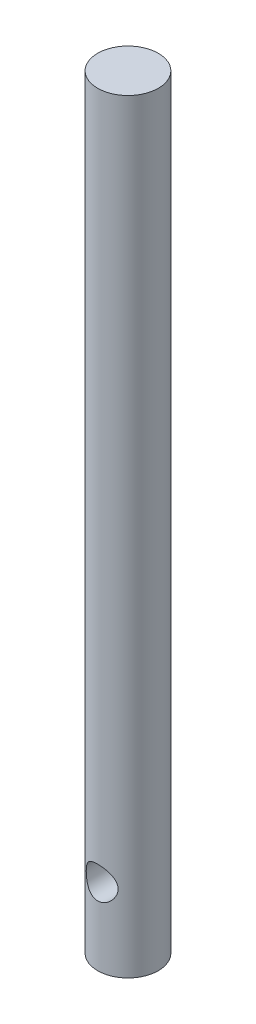
ISO-10303-21;
HEADER;
FILE_DESCRIPTION(('STEP AP214'),'2;1');
FILE_NAME('part.step','',(''),(''),'','','');
FILE_SCHEMA(('AUTOMOTIVE_DESIGN { 1 0 10303 214 1 1 1 1 }'));
ENDSEC;
DATA;
#1=APPLICATION_CONTEXT('core data for automotive mechanical design processes');
#2=APPLICATION_PROTOCOL_DEFINITION('international standard','automotive_design',2000,#1);
#3=PRODUCT_CONTEXT('',#1,'mechanical');
#4=PRODUCT('Part','Part','',(#3));
#5=PRODUCT_RELATED_PRODUCT_CATEGORY('part','',(#4));
#6=PRODUCT_DEFINITION_FORMATION('','',#4);
#7=PRODUCT_DEFINITION_CONTEXT('part definition',#1,'design');
#8=PRODUCT_DEFINITION('design','',#6,#7);
#9=PRODUCT_DEFINITION_SHAPE('','',#8);
#10=(LENGTH_UNIT() NAMED_UNIT(*) SI_UNIT(.MILLI.,.METRE.));
#11=(NAMED_UNIT(*) PLANE_ANGLE_UNIT() SI_UNIT($,.RADIAN.));
#12=(NAMED_UNIT(*) SI_UNIT($,.STERADIAN.) SOLID_ANGLE_UNIT());
#13=UNCERTAINTY_MEASURE_WITH_UNIT(LENGTH_MEASURE(1.E-05),#10,'distance_accuracy_value','');
#14=(GEOMETRIC_REPRESENTATION_CONTEXT(3) GLOBAL_UNCERTAINTY_ASSIGNED_CONTEXT((#13)) GLOBAL_UNIT_ASSIGNED_CONTEXT((#10,
#11,#12)) REPRESENTATION_CONTEXT('',''));
#15=CARTESIAN_POINT('',(0.,0.,0.));
#16=DIRECTION('',(0.,0.,1.));
#17=DIRECTION('',(1.,0.,0.));
#18=AXIS2_PLACEMENT_3D('',#15,#16,#17);
#19=CARTESIAN_POINT('',(0.,120.,0.));
#20=DIRECTION('',(0.,-1.,0.));
#21=DIRECTION('',(0.,0.,-1.));
#22=AXIS2_PLACEMENT_3D('',#19,#20,#21);
#23=CYLINDRICAL_SURFACE('',#22,4.7625);
#24=CARTESIAN_POINT('',(0.,14.5,-4.7625));
#25=CARTESIAN_POINT('',(-0.13062742122521,14.4999898734514,-4.76249124231613));
#26=CARTESIAN_POINT('',(-0.261392577954304,14.4897011265119,-4.75706877903841));
#27=CARTESIAN_POINT('',(-0.519004450887695,14.4490214465179,-4.73590787240178));
#28=CARTESIAN_POINT('',(-0.645844384851267,14.4185975537372,-4.72015251525231));
#29=CARTESIAN_POINT('',(-0.891501022140106,14.3391928326362,-4.67996420289121));
#30=CARTESIAN_POINT('',(-1.01034767016377,14.2902864003055,-4.65556606099746));
#31=CARTESIAN_POINT('',(-1.23794382020764,14.1757168882932,-4.60028670223669));
#32=CARTESIAN_POINT('',(-1.34669348083588,14.1100540718892,-4.56940558723199));
#33=CARTESIAN_POINT('',(-1.55892133995746,13.959033008405,-4.50159635346788));
#34=CARTESIAN_POINT('',(-1.66160312776822,13.8726752730372,-4.4644062529016));
#35=CARTESIAN_POINT('',(-1.85177188990194,13.6848795061989,-4.38894458289406));
#36=CARTESIAN_POINT('',(-1.93924600469647,13.5834288454403,-4.35067212970659));
#37=CARTESIAN_POINT('',(-2.10422763598031,13.3577376835749,-4.2734802142377));
#38=CARTESIAN_POINT('',(-2.18018973516794,13.2322790849485,-4.23479802820823));
#39=CARTESIAN_POINT('',(-2.30963791504339,12.9680499369322,-4.16562294885068));
#40=CARTESIAN_POINT('',(-2.36314108926497,12.8292896106869,-4.13512383377351));
#41=CARTESIAN_POINT('',(-2.4232489502503,12.6186966833969,-4.09996952403756));
#42=CARTESIAN_POINT('',(-2.43967751578654,12.5503969014835,-4.09018641832971));
#43=CARTESIAN_POINT('',(-2.46677009527986,12.4122930024643,-4.07390549926443));
#44=CARTESIAN_POINT('',(-2.47743732586381,12.3424897474527,-4.06740585284109));
#45=CARTESIAN_POINT('',(-2.49282280702981,12.2020414408674,-4.05799501167303));
#46=CARTESIAN_POINT('',(-2.4975455796926,12.1313970704988,-4.05508108922647));
#47=CARTESIAN_POINT('',(-2.50098217922734,11.9899299323812,-4.05296092161601));
#48=CARTESIAN_POINT('',(-2.49969669147794,11.9191071859012,-4.05375425355549));
#49=CARTESIAN_POINT('',(-2.48799202626699,11.7265265787753,-4.06096295843877));
#50=CARTESIAN_POINT('',(-2.47160741979408,11.6052041391416,-4.07104911907534));
#51=CARTESIAN_POINT('',(-2.4217116946248,11.3674555676512,-4.10091839522592));
#52=CARTESIAN_POINT('',(-2.38819409172343,11.2510313076425,-4.12070518195181));
#53=CARTESIAN_POINT('',(-2.30445419048023,11.0229734463351,-4.16812330580372));
#54=CARTESIAN_POINT('',(-2.25386859885826,10.9115094942428,-4.19592314410569));
#55=CARTESIAN_POINT('',(-2.13771806028806,10.6981000286017,-4.25627134083856));
#56=CARTESIAN_POINT('',(-2.07214642279414,10.5961587952102,-4.28882181784726));
#57=CARTESIAN_POINT('',(-1.91707717493105,10.389477963539,-4.36056222368142));
#58=CARTESIAN_POINT('',(-1.82550601334369,10.2863879547987,-4.40003945957641));
#59=CARTESIAN_POINT('',(-1.62631292573417,10.0963000566835,-4.47749235013782));
#60=CARTESIAN_POINT('',(-1.51868183519853,10.0093114193899,-4.51546713168007));
#61=CARTESIAN_POINT('',(-1.28285311381234,9.84925644738106,-4.58821726237082));
#62=CARTESIAN_POINT('',(-1.15384113644327,9.77724297891873,-4.62269422182368));
#63=CARTESIAN_POINT('',(-0.883274583487361,9.65655951919273,-4.68191671322414));
#64=CARTESIAN_POINT('',(-0.741731021742617,9.60786926609562,-4.70667068854853));
#65=CARTESIAN_POINT('',(-0.463482648356823,9.53954031968048,-4.74178157874757));
#66=CARTESIAN_POINT('',(-0.327451533146031,9.51771868966614,-4.7532154346413));
#67=CARTESIAN_POINT('',(-0.0532027411688526,9.49679213134956,-4.76417535094783));
#68=CARTESIAN_POINT('',(0.0850136913180013,9.49767471039915,-4.76370795984351));
#69=CARTESIAN_POINT('',(0.346844432807783,9.52099639780689,-4.75150400862097));
#70=CARTESIAN_POINT('',(0.470680368684627,9.54154746222735,-4.74075451239977));
#71=CARTESIAN_POINT('',(0.712860226199036,9.60054849782026,-4.710428305764));
#72=CARTESIAN_POINT('',(0.831203566825309,9.63900035782977,-4.69085066383741));
#73=CARTESIAN_POINT('',(1.06265581547702,9.73354813372294,-4.64397292939134));
#74=CARTESIAN_POINT('',(1.17554845250708,9.79007704285111,-4.61648518425677));
#75=CARTESIAN_POINT('',(1.39058524799197,9.91865766067269,-4.55633242252807));
#76=CARTESIAN_POINT('',(1.49272507029362,9.99071559614235,-4.52366533052982));
#77=CARTESIAN_POINT('',(1.69480039032759,10.1570314052753,-4.45215890340881));
#78=CARTESIAN_POINT('',(1.79336890820231,10.2528286364182,-4.41303191650165));
#79=CARTESIAN_POINT('',(1.97371435217978,10.4594542622761,-4.33537986737606));
#80=CARTESIAN_POINT('',(2.0554767234399,10.5702955490265,-4.2968553533759));
#81=CARTESIAN_POINT('',(2.20479830589222,10.8124293314126,-4.22228238623147));
#82=CARTESIAN_POINT('',(2.27115503352735,10.9445658072701,-4.18653780097845));
#83=CARTESIAN_POINT('',(2.37999935200244,11.2205600641342,-4.1256452905888));
#84=CARTESIAN_POINT('',(2.42252029102059,11.3644011449544,-4.10048257295431));
#85=CARTESIAN_POINT('',(2.47834245295767,11.6447599982397,-4.06696362690653));
#86=CARTESIAN_POINT('',(2.49409685007316,11.780615988852,-4.05720315494866));
#87=CARTESIAN_POINT('',(2.50314491556986,12.0533274801695,-4.05163151557573));
#88=CARTESIAN_POINT('',(2.49645222775029,12.190182323289,-4.05581187462847));
#89=CARTESIAN_POINT('',(2.46314240917376,12.4443675606173,-4.07610444272209));
#90=CARTESIAN_POINT('',(2.43889590355155,12.5621384578597,-4.09079472815573));
#91=CARTESIAN_POINT('',(2.37431443322139,12.7917471574109,-4.12861104406669));
#92=CARTESIAN_POINT('',(2.33397375533869,12.9035828368216,-4.15174006991293));
#93=CARTESIAN_POINT('',(2.23544120066941,13.1263205613456,-4.20565680812175));
#94=CARTESIAN_POINT('',(2.17625269942798,13.2366811014084,-4.23684709813602));
#95=CARTESIAN_POINT('',(2.04272583561235,13.4466414920505,-4.3028159585722));
#96=CARTESIAN_POINT('',(1.96837932494082,13.546235510904,-4.33759645390213));
#97=CARTESIAN_POINT('',(1.79459058186513,13.7462330108181,-4.41259367454238));
#98=CARTESIAN_POINT('',(1.69309805784772,13.8448341824611,-4.45289552478304));
#99=CARTESIAN_POINT('',(1.47411879819776,14.0241110762157,-4.53010856140779));
#100=CARTESIAN_POINT('',(1.35662228435693,14.1047757594497,-4.5670176515924));
#101=CARTESIAN_POINT('',(1.10544584264605,14.2470313869532,-4.63427836398848));
#102=CARTESIAN_POINT('',(0.971495879698246,14.3082213726477,-4.66448867543812));
#103=CARTESIAN_POINT('',(0.763036809787704,14.3818526348882,-4.70151003933909));
#104=CARTESIAN_POINT('',(0.692342196853615,14.4033628339738,-4.71246380035833));
#105=CARTESIAN_POINT('',(0.548955469041315,14.4401049441725,-4.73130690436663));
#106=CARTESIAN_POINT('',(0.476264516496302,14.4553404292937,-4.73919799167296));
#107=CARTESIAN_POINT('',(0.3364909629389,14.4781652148227,-4.7510655397769));
#108=CARTESIAN_POINT('',(0.269529218241733,14.486342015509,-4.75534196795002));
#109=CARTESIAN_POINT('',(0.135057265858516,14.4972620796448,-4.76106149016355));
#110=CARTESIAN_POINT('',(0.0675470474296414,14.5000052364079,-4.76250452857204));
#111=CARTESIAN_POINT('',(0.,14.5,-4.7625));
#112=B_SPLINE_CURVE_WITH_KNOTS('',3,(#24,#25,#26,#27,#28,#29,#30,#31,#32,#33,#34,#35,#36,#37,
#38,#39,#40,#41,#42,#43,#44,#45,#46,#47,#48,#49,#50,#51,#52,#53,#54,#55,#56,#57,#58,#59,#60,#61,
#62,#63,#64,#65,#66,#67,#68,#69,#70,#71,#72,#73,#74,#75,#76,#77,#78,#79,#80,#81,#82,#83,#84,#85,
#86,#87,#88,#89,#90,#91,#92,#93,#94,#95,#96,#97,#98,#99,#100,#101,#102,#103,#104,#105,#106,#107,
#108,#109,#110,#111),.UNSPECIFIED.,.T.,.F.,(4,2,2,2,2,2,2,2,2,2,2,2,2,2,2,2,2,2,2,2,2,2,2,2,2,2,
2,2,2,2,2,2,2,2,2,2,2,2,2,2,2,2,2,4),(0.,0.391620082278686,0.783882808141719,1.1745831294099,
1.56527731234245,1.98125165511737,2.39757605063155,2.85038836854084,3.3028554224343,
3.51536409838199,3.72775400505128,3.9399822441746,4.15218627443491,4.51879860111648,
4.88554977983685,5.26065926095994,5.63593653862843,6.06437983295362,6.49306855787107,
6.94577147619026,7.39808039643924,7.81050976496993,8.22271220532542,8.59894014659636,
8.97520779528724,9.36126420535266,9.74747570398919,10.1743931854572,10.6016788522686,
11.0555893773158,11.5088632499591,11.9177593954284,12.3264070504746,12.6882353422642,
13.0501921917826,13.4358699623552,13.8217556009127,14.2611437594709,14.7008015922909,
15.1490000544963,15.3728142955346,15.5965008775434,15.7990024706602,16.0015080397357),.UNSPECIFIED.);
#113=CARTESIAN_POINT('',(0.,14.5,-4.7625));
#114=VERTEX_POINT('',#113);
#115=EDGE_CURVE('E41',#114,#114,#112,.T.);
#116=ORIENTED_EDGE('',*,*,#115,.T.);
#117=EDGE_LOOP('',(#116));
#118=FACE_BOUND('',#117,.T.);
#119=CARTESIAN_POINT('',(2.5,12.,4.0535671019486));
#120=CARTESIAN_POINT('',(2.49998869706605,11.8707732950249,4.05358155018871));
#121=CARTESIAN_POINT('',(2.48991105568996,11.741401526934,4.05984331937364));
#122=CARTESIAN_POINT('',(2.45014948016903,11.486716260739,4.08395350743042));
#123=CARTESIAN_POINT('',(2.42042849301436,11.3614109025898,4.1018238222703));
#124=CARTESIAN_POINT('',(2.34307279773326,11.1190312934302,4.14648999026816));
#125=CARTESIAN_POINT('',(2.29554113055471,11.001914208541,4.17323440370484));
#126=CARTESIAN_POINT('',(2.18422896234465,10.7773516966092,4.23255437021237));
#127=CARTESIAN_POINT('',(2.12044624392419,10.6699075921146,4.26513071884621));
#128=CARTESIAN_POINT('',(1.9716136156043,10.4569104105851,4.33607390604297));
#129=CARTESIAN_POINT('',(1.88515226386528,10.3524287860355,4.37469784594103));
#130=CARTESIAN_POINT('',(1.69634194817531,10.1586029969336,4.45131621590864));
#131=CARTESIAN_POINT('',(1.59398438723809,10.0692670784888,4.48931029295718));
#132=CARTESIAN_POINT('',(1.36677385411325,9.90158717375119,4.56384436801898));
#133=CARTESIAN_POINT('',(1.24080116837223,9.82459912624898,4.60005306383515));
#134=CARTESIAN_POINT('',(0.97543288830488,9.69340280761102,4.66352786792427));
#135=CARTESIAN_POINT('',(0.83604670017772,9.63917871432398,4.69080018454971));
#136=CARTESIAN_POINT('',(0.559191477623147,9.55942106703611,4.73146392249663));
#137=CARTESIAN_POINT('',(0.422403427619912,9.53199756561953,4.74576355584999));
#138=CARTESIAN_POINT('',(0.1454820812532,9.50035650359164,4.76229256053164));
#139=CARTESIAN_POINT('',(0.00535111674635169,9.49612321605075,4.76453011199715));
#140=CARTESIAN_POINT('',(-0.259904747937711,9.5103434880472,4.75707668766096));
#141=CARTESIAN_POINT('',(-0.385183297595461,9.5266664608496,4.74850584675111));
#142=CARTESIAN_POINT('',(-0.630918175979703,9.577668334505,4.72214158607341));
#143=CARTESIAN_POINT('',(-0.751374139227371,9.61234862374212,4.7043474687411));
#144=CARTESIAN_POINT('',(-0.985998949651414,9.69920414178401,4.66086274593815));
#145=CARTESIAN_POINT('',(-1.10007008669133,9.7515931746438,4.63507597444879));
#146=CARTESIAN_POINT('',(-1.31805483658927,9.87203025719957,4.57786583958745));
#147=CARTESIAN_POINT('',(-1.42196495401553,9.94008366869257,4.54644054700678));
#148=CARTESIAN_POINT('',(-1.62792806701274,10.0978071319686,4.47707798878575));
#149=CARTESIAN_POINT('',(-1.72872567621166,10.1889689365131,4.43880353081597));
#150=CARTESIAN_POINT('',(-1.91431417263391,10.3863762349171,4.36198539495372));
#151=CARTESIAN_POINT('',(-1.9990905749337,10.492635227701,4.32344150579994));
#152=CARTESIAN_POINT('',(-2.15652989416418,10.7269113041664,4.24723430473677));
#153=CARTESIAN_POINT('',(-2.22780472796274,10.855963170165,4.20985457132401));
#154=CARTESIAN_POINT('',(-2.34711530534315,11.1265862579585,4.14452940307585));
#155=CARTESIAN_POINT('',(-2.3951769886873,11.2681432954218,4.11657344815268));
#156=CARTESIAN_POINT('',(-2.46262023024508,11.5478146333387,4.07656013168827));
#157=CARTESIAN_POINT('',(-2.48400859742463,11.685279924087,4.0633989192229));
#158=CARTESIAN_POINT('',(-2.50356480917394,11.9624253317312,4.05138613417128));
#159=CARTESIAN_POINT('',(-2.50175340743737,12.1021033574697,4.05252177211224));
#160=CARTESIAN_POINT('',(-2.47680270725707,12.3607948980627,4.06779972706266));
#161=CARTESIAN_POINT('',(-2.456389999402,12.4801875632937,4.08027875514125));
#162=CARTESIAN_POINT('',(-2.39901216210818,12.7135753338469,4.11427399976394));
#163=CARTESIAN_POINT('',(-2.36204087468126,12.827568413656,4.13579357822339));
#164=CARTESIAN_POINT('',(-2.27090127822651,13.0528242933138,4.18655439239468));
#165=CARTESIAN_POINT('',(-2.21603316042394,13.1637326357798,4.21609986321794));
#166=CARTESIAN_POINT('',(-2.09124845864274,13.3754257031947,4.27936657796332));
#167=CARTESIAN_POINT('',(-2.02132415897772,13.4762051985322,4.31308995911934));
#168=CARTESIAN_POINT('',(-1.85686350018246,13.6797350225483,4.38664702782121));
#169=CARTESIAN_POINT('',(-1.76024370703618,13.7807415905593,4.4266694841694));
#170=CARTESIAN_POINT('',(-1.55094268645915,13.9657293717269,4.50426941857243));
#171=CARTESIAN_POINT('',(-1.43825421408011,14.0497028635153,4.54184578255617));
#172=CARTESIAN_POINT('',(-1.1944533044092,14.2010473508802,4.61208757963877));
#173=CARTESIAN_POINT('',(-1.06280955519209,14.2676802295708,4.64451687647837));
#174=CARTESIAN_POINT('',(-0.787990454311554,14.3771598563337,4.69893882577575));
#175=CARTESIAN_POINT('',(-0.644826350425626,14.4200294903338,4.72094151692398));
#176=CARTESIAN_POINT('',(-0.36604033849742,14.4767406338433,4.75027670675181));
#177=CARTESIAN_POINT('',(-0.23103813027395,14.4929988654877,4.75882737764507));
#178=CARTESIAN_POINT('',(0.0400265506265892,14.5033512619145,4.76425718580342));
#179=CARTESIAN_POINT('',(0.176088542971746,14.4974549440015,4.76114133485555));
#180=CARTESIAN_POINT('',(0.434301439286159,14.4651581757002,4.74428608238895));
#181=CARTESIAN_POINT('',(0.556715844286672,14.4403743572601,4.73138464835046));
#182=CARTESIAN_POINT('',(0.795399578587137,14.3733335571387,4.69715759771685));
#183=CARTESIAN_POINT('',(0.911668103423989,14.3310742943706,4.67583088137765));
#184=CARTESIAN_POINT('',(1.13993680106357,14.2286341488799,4.62559714510857));
#185=CARTESIAN_POINT('',(1.25159057564476,14.167815222074,4.59642556520951));
#186=CARTESIAN_POINT('',(1.46353024828904,14.0307701264465,4.53340159264633));
#187=CARTESIAN_POINT('',(1.56381109692099,13.9545371554666,4.49954713553742));
#188=CARTESIAN_POINT('',(1.76159457801021,13.7793426122511,4.4261134843765));
#189=CARTESIAN_POINT('',(1.85763283248131,13.6788169070002,4.38631055114927));
#190=CARTESIAN_POINT('',(2.03210979228154,13.4628231729599,4.30825829063563));
#191=CARTESIAN_POINT('',(2.11053007301187,13.3473396986518,4.2700106237309));
#192=CARTESIAN_POINT('',(2.25099897013246,13.0974716779514,4.19773440164826));
#193=CARTESIAN_POINT('',(2.31208207203423,12.9624462831194,4.16399615442644));
#194=CARTESIAN_POINT('',(2.38533226509582,12.7521361345562,4.12218109715731));
#195=CARTESIAN_POINT('',(2.40667590903792,12.6808032889455,4.10971521285612));
#196=CARTESIAN_POINT('',(2.44299231830247,12.5360443188191,4.08823227940076));
#197=CARTESIAN_POINT('',(2.45796936573903,12.4626196368316,4.0792129125647));
#198=CARTESIAN_POINT('',(2.47970418671099,12.3244534521714,4.06603159592514));
#199=CARTESIAN_POINT('',(2.48730322492522,12.259890351019,4.0613755934854));
#200=CARTESIAN_POINT('',(2.49745411582463,12.1302304696597,4.05513962260664));
#201=CARTESIAN_POINT('',(2.50000569697624,12.0651336609306,4.05355981965527));
#202=CARTESIAN_POINT('',(2.5,12.,4.0535671019486));
#203=B_SPLINE_CURVE_WITH_KNOTS('',3,(#119,#120,#121,#122,#123,#124,#125,#126,#127,#128,#129,
#130,#131,#132,#133,#134,#135,#136,#137,#138,#139,#140,#141,#142,#143,#144,#145,#146,#147,#148,
#149,#150,#151,#152,#153,#154,#155,#156,#157,#158,#159,#160,#161,#162,#163,#164,#165,#166,#167,
#168,#169,#170,#171,#172,#173,#174,#175,#176,#177,#178,#179,#180,#181,#182,#183,#184,#185,#186,
#187,#188,#189,#190,#191,#192,#193,#194,#195,#196,#197,#198,#199,#200,#201,#202),.UNSPECIFIED.,
.T.,.F.,(4,2,2,2,2,2,2,2,2,2,2,2,2,2,2,2,2,2,2,2,2,2,2,2,2,2,2,2,2,2,2,2,2,2,2,2,2,2,2,2,2,4),
(0.,0.387414955614019,0.775562781108782,1.16149886355836,1.54748763362231,1.96877421603462,
2.39028943718404,2.84391777817052,3.29723029937127,3.71558713848775,4.13366022498953,
4.5117576188095,4.88988361263968,5.27274837347408,5.65574438138687,6.07755403993297,
6.49974325493495,6.95364262863329,7.40703360772764,7.8237204965316,8.24003465802089,
8.60369224110177,8.96748517763777,9.34767003660058,9.72805019065111,10.1623228783737,
10.5967919911013,11.0475050228372,11.4977832239137,11.9042897300778,12.3106216263396,
12.6856118000394,13.0606509370308,13.4504032609032,13.8403279578372,14.2722791625114,
14.7046800136668,15.1578179074807,15.3839909441988,15.6100116173974,15.8052684491429,
16.0005357846621),.UNSPECIFIED.);
#204=CARTESIAN_POINT('',(2.5,12.,4.0535671019486));
#205=VERTEX_POINT('',#204);
#206=EDGE_CURVE('E54',#205,#205,#203,.T.);
#207=ORIENTED_EDGE('',*,*,#206,.T.);
#208=EDGE_LOOP('',(#207));
#209=FACE_BOUND('',#208,.T.);
#210=CARTESIAN_POINT('',(0.,120.,0.));
#211=DIRECTION('',(0.,1.,0.));
#212=DIRECTION('',(0.,0.,1.));
#213=AXIS2_PLACEMENT_3D('',#210,#211,#212);
#214=CIRCLE('',#213,4.7625);
#215=CARTESIAN_POINT('',(0.,120.,4.7625));
#216=VERTEX_POINT('',#215);
#217=EDGE_CURVE('E10',#216,#216,#214,.T.);
#218=ORIENTED_EDGE('',*,*,#217,.F.);
#219=EDGE_LOOP('',(#218));
#220=FACE_BOUND('',#219,.T.);
#221=CARTESIAN_POINT('',(0.,0.,0.));
#222=DIRECTION('',(0.,1.,0.));
#223=DIRECTION('',(0.,0.,1.));
#224=AXIS2_PLACEMENT_3D('',#221,#222,#223);
#225=CIRCLE('',#224,4.7625);
#226=CARTESIAN_POINT('',(0.,0.,4.7625));
#227=VERTEX_POINT('',#226);
#228=EDGE_CURVE('E47',#227,#227,#225,.T.);
#229=ORIENTED_EDGE('',*,*,#228,.T.);
#230=EDGE_LOOP('',(#229));
#231=FACE_BOUND('',#230,.T.);
#232=ADVANCED_FACE('F40',(#118,#209,#220,#231),#23,.T.);
#233=CARTESIAN_POINT('',(0.,120.,0.));
#234=DIRECTION('',(0.,1.,0.));
#235=DIRECTION('',(0.,0.,1.));
#236=AXIS2_PLACEMENT_3D('',#233,#234,#235);
#237=PLANE('',#236);
#238=ORIENTED_EDGE('',*,*,#217,.T.);
#239=EDGE_LOOP('',(#238));
#240=FACE_BOUND('',#239,.T.);
#241=ADVANCED_FACE('F66',(#240),#237,.T.);
#242=CARTESIAN_POINT('',(0.,0.,0.));
#243=DIRECTION('',(0.,1.,0.));
#244=DIRECTION('',(0.,0.,1.));
#245=AXIS2_PLACEMENT_3D('',#242,#243,#244);
#246=PLANE('',#245);
#247=ORIENTED_EDGE('',*,*,#228,.F.);
#248=EDGE_LOOP('',(#247));
#249=FACE_BOUND('',#248,.T.);
#250=ADVANCED_FACE('F63',(#249),#246,.F.);
#251=CARTESIAN_POINT('',(0.,12.,-15.));
#252=DIRECTION('',(0.,0.,1.));
#253=DIRECTION('',(1.,0.,0.));
#254=AXIS2_PLACEMENT_3D('',#251,#252,#253);
#255=CYLINDRICAL_SURFACE('',#254,2.5);
#256=ORIENTED_EDGE('',*,*,#206,.F.);
#257=EDGE_LOOP('',(#256));
#258=FACE_BOUND('',#257,.T.);
#259=ORIENTED_EDGE('',*,*,#115,.F.);
#260=EDGE_LOOP('',(#259));
#261=FACE_BOUND('',#260,.T.);
#262=ADVANCED_FACE('F58',(#258,#261),#255,.F.);
#263=CLOSED_SHELL('',(#232,#241,#250,#262));
#264=MANIFOLD_SOLID_BREP('B2',#263);
#265=ADVANCED_BREP_SHAPE_REPRESENTATION('',(#18,#264),#14);
#266=SHAPE_DEFINITION_REPRESENTATION(#9,#265);
ENDSEC;
END-ISO-10303-21;
